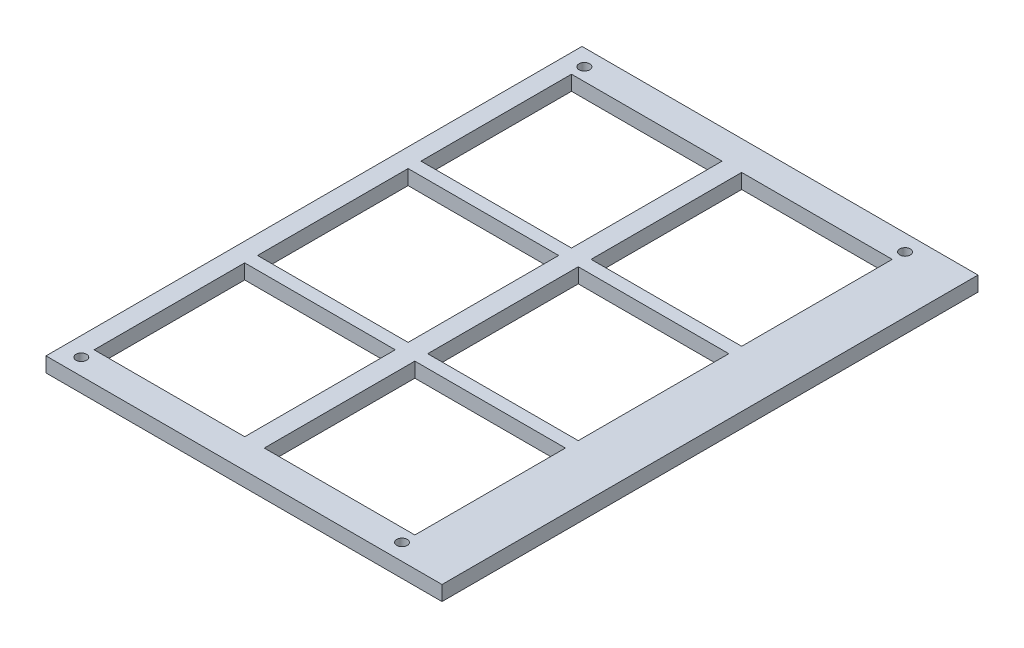
ISO-10303-21;
HEADER;
FILE_DESCRIPTION(('STEP AP214'),'2;1');
FILE_NAME('part.step','',(''),(''),'','','');
FILE_SCHEMA(('AUTOMOTIVE_DESIGN { 1 0 10303 214 1 1 1 1 }'));
ENDSEC;
DATA;
#1=APPLICATION_CONTEXT('core data for automotive mechanical design processes');
#2=APPLICATION_PROTOCOL_DEFINITION('international standard','automotive_design',2000,#1);
#3=PRODUCT_CONTEXT('',#1,'mechanical');
#4=PRODUCT('Part','Part','',(#3));
#5=PRODUCT_RELATED_PRODUCT_CATEGORY('part','',(#4));
#6=PRODUCT_DEFINITION_FORMATION('','',#4);
#7=PRODUCT_DEFINITION_CONTEXT('part definition',#1,'design');
#8=PRODUCT_DEFINITION('design','',#6,#7);
#9=PRODUCT_DEFINITION_SHAPE('','',#8);
#10=(LENGTH_UNIT() NAMED_UNIT(*) SI_UNIT(.MILLI.,.METRE.));
#11=(NAMED_UNIT(*) PLANE_ANGLE_UNIT() SI_UNIT($,.RADIAN.));
#12=(NAMED_UNIT(*) SI_UNIT($,.STERADIAN.) SOLID_ANGLE_UNIT());
#13=UNCERTAINTY_MEASURE_WITH_UNIT(LENGTH_MEASURE(1.E-05),#10,'distance_accuracy_value','');
#14=(GEOMETRIC_REPRESENTATION_CONTEXT(3) GLOBAL_UNCERTAINTY_ASSIGNED_CONTEXT((#13)) GLOBAL_UNIT_ASSIGNED_CONTEXT((#10,
#11,#12)) REPRESENTATION_CONTEXT('',''));
#15=CARTESIAN_POINT('',(0.,0.,0.));
#16=DIRECTION('',(0.,0.,1.));
#17=DIRECTION('',(1.,0.,0.));
#18=AXIS2_PLACEMENT_3D('',#15,#16,#17);
#19=CARTESIAN_POINT('',(0.,10.,0.));
#20=DIRECTION('',(0.,1.,0.));
#21=DIRECTION('',(0.,0.,1.));
#22=AXIS2_PLACEMENT_3D('',#19,#20,#21);
#23=PLANE('',#22);
#24=DIRECTION('',(0.,0.,1.));
#25=VECTOR('',#24,1.);
#26=CARTESIAN_POINT('',(-6.09,10.,59.465));
#27=LINE('',#26,#25);
#28=CARTESIAN_POINT('',(-6.09,10.,59.465));
#29=VERTEX_POINT('',#28);
#30=CARTESIAN_POINT('',(-6.09000000000003,10.,161.065));
#31=VERTEX_POINT('',#30);
#32=EDGE_CURVE('E48',#29,#31,#27,.T.);
#33=ORIENTED_EDGE('',*,*,#32,.F.);
#34=DIRECTION('',(-1.,0.,0.));
#35=VECTOR('',#34,1.);
#36=CARTESIAN_POINT('',(-6.09,10.,59.465));
#37=LINE('',#36,#35);
#38=CARTESIAN_POINT('',(95.51,10.,59.465));
#39=VERTEX_POINT('',#38);
#40=EDGE_CURVE('E236',#39,#29,#37,.T.);
#41=ORIENTED_EDGE('',*,*,#40,.F.);
#42=DIRECTION('',(0.,0.,-1.));
#43=VECTOR('',#42,1.);
#44=CARTESIAN_POINT('',(95.51,10.,59.465));
#45=LINE('',#44,#43);
#46=CARTESIAN_POINT('',(95.51,10.,161.065));
#47=VERTEX_POINT('',#46);
#48=EDGE_CURVE('E239',#47,#39,#45,.T.);
#49=ORIENTED_EDGE('',*,*,#48,.F.);
#50=DIRECTION('',(1.,0.,0.));
#51=VECTOR('',#50,1.);
#52=CARTESIAN_POINT('',(-6.09000000000003,10.,161.065));
#53=LINE('',#52,#51);
#54=EDGE_CURVE('E245',#31,#47,#53,.T.);
#55=ORIENTED_EDGE('',*,*,#54,.F.);
#56=EDGE_LOOP('',(#33,#41,#49,#55));
#57=FACE_BOUND('',#56,.T.);
#58=DIRECTION('',(0.,0.,1.));
#59=VECTOR('',#58,1.);
#60=CARTESIAN_POINT('',(-6.09000000000003,10.,-161.065));
#61=LINE('',#60,#59);
#62=CARTESIAN_POINT('',(-6.09000000000003,10.,-161.065));
#63=VERTEX_POINT('',#62);
#64=CARTESIAN_POINT('',(-6.09000000000005,10.,-59.465));
#65=VERTEX_POINT('',#64);
#66=EDGE_CURVE('E251',#63,#65,#61,.T.);
#67=ORIENTED_EDGE('',*,*,#66,.F.);
#68=DIRECTION('',(-1.,0.,0.));
#69=VECTOR('',#68,1.);
#70=CARTESIAN_POINT('',(-6.09000000000003,10.,-161.065));
#71=LINE('',#70,#69);
#72=CARTESIAN_POINT('',(95.51,10.,-161.065));
#73=VERTEX_POINT('',#72);
#74=EDGE_CURVE('E259',#73,#63,#71,.T.);
#75=ORIENTED_EDGE('',*,*,#74,.F.);
#76=DIRECTION('',(0.,0.,-1.));
#77=VECTOR('',#76,1.);
#78=CARTESIAN_POINT('',(95.51,10.,-161.065));
#79=LINE('',#78,#77);
#80=CARTESIAN_POINT('',(95.51,10.,-59.465));
#81=VERTEX_POINT('',#80);
#82=EDGE_CURVE('E273',#81,#73,#79,.T.);
#83=ORIENTED_EDGE('',*,*,#82,.F.);
#84=DIRECTION('',(1.,0.,0.));
#85=VECTOR('',#84,1.);
#86=CARTESIAN_POINT('',(-6.09000000000005,10.,-59.465));
#87=LINE('',#86,#85);
#88=EDGE_CURVE('E270',#65,#81,#87,.T.);
#89=ORIENTED_EDGE('',*,*,#88,.F.);
#90=EDGE_LOOP('',(#67,#75,#83,#89));
#91=FACE_BOUND('',#90,.T.);
#92=DIRECTION('',(0.,0.,1.));
#93=VECTOR('',#92,1.);
#94=CARTESIAN_POINT('',(-6.09000000000001,10.,-50.8));
#95=LINE('',#94,#93);
#96=CARTESIAN_POINT('',(-6.09000000000001,10.,-50.8));
#97=VERTEX_POINT('',#96);
#98=CARTESIAN_POINT('',(-6.09000000000004,10.,50.8));
#99=VERTEX_POINT('',#98);
#100=EDGE_CURVE('E280',#97,#99,#95,.T.);
#101=ORIENTED_EDGE('',*,*,#100,.F.);
#102=DIRECTION('',(-1.,0.,0.));
#103=VECTOR('',#102,1.);
#104=CARTESIAN_POINT('',(-6.09000000000001,10.,-50.8));
#105=LINE('',#104,#103);
#106=CARTESIAN_POINT('',(95.51,10.,-50.8));
#107=VERTEX_POINT('',#106);
#108=EDGE_CURVE('E291',#107,#97,#105,.T.);
#109=ORIENTED_EDGE('',*,*,#108,.F.);
#110=DIRECTION('',(0.,0.,-1.));
#111=VECTOR('',#110,1.);
#112=CARTESIAN_POINT('',(95.51,10.,-50.8));
#113=LINE('',#112,#111);
#114=CARTESIAN_POINT('',(95.51,10.,50.8));
#115=VERTEX_POINT('',#114);
#116=EDGE_CURVE('E305',#115,#107,#113,.T.);
#117=ORIENTED_EDGE('',*,*,#116,.F.);
#118=DIRECTION('',(1.,0.,0.));
#119=VECTOR('',#118,1.);
#120=CARTESIAN_POINT('',(-6.09000000000004,10.,50.8));
#121=LINE('',#120,#119);
#122=EDGE_CURVE('E302',#99,#115,#121,.T.);
#123=ORIENTED_EDGE('',*,*,#122,.F.);
#124=EDGE_LOOP('',(#101,#109,#117,#123));
#125=FACE_BOUND('',#124,.T.);
#126=DIRECTION('',(0.,0.,1.));
#127=VECTOR('',#126,1.);
#128=CARTESIAN_POINT('',(-120.91,10.,59.465));
#129=LINE('',#128,#127);
#130=CARTESIAN_POINT('',(-120.91,10.,59.465));
#131=VERTEX_POINT('',#130);
#132=CARTESIAN_POINT('',(-120.91,10.,161.065));
#133=VERTEX_POINT('',#132);
#134=EDGE_CURVE('E312',#131,#133,#129,.T.);
#135=ORIENTED_EDGE('',*,*,#134,.F.);
#136=DIRECTION('',(-1.,0.,0.));
#137=VECTOR('',#136,1.);
#138=CARTESIAN_POINT('',(-120.91,10.,59.465));
#139=LINE('',#138,#137);
#140=CARTESIAN_POINT('',(-19.31,10.,59.465));
#141=VERTEX_POINT('',#140);
#142=EDGE_CURVE('E323',#141,#131,#139,.T.);
#143=ORIENTED_EDGE('',*,*,#142,.F.);
#144=DIRECTION('',(0.,0.,-1.));
#145=VECTOR('',#144,1.);
#146=CARTESIAN_POINT('',(-19.31,10.,59.465));
#147=LINE('',#146,#145);
#148=CARTESIAN_POINT('',(-19.31,10.,161.065));
#149=VERTEX_POINT('',#148);
#150=EDGE_CURVE('E337',#149,#141,#147,.T.);
#151=ORIENTED_EDGE('',*,*,#150,.F.);
#152=DIRECTION('',(1.,0.,0.));
#153=VECTOR('',#152,1.);
#154=CARTESIAN_POINT('',(-120.91,10.,161.065));
#155=LINE('',#154,#153);
#156=EDGE_CURVE('E334',#133,#149,#155,.T.);
#157=ORIENTED_EDGE('',*,*,#156,.F.);
#158=EDGE_LOOP('',(#135,#143,#151,#157));
#159=FACE_BOUND('',#158,.T.);
#160=DIRECTION('',(0.,0.,1.));
#161=VECTOR('',#160,1.);
#162=CARTESIAN_POINT('',(-120.91,10.,-161.065));
#163=LINE('',#162,#161);
#164=CARTESIAN_POINT('',(-120.91,10.,-161.065));
#165=VERTEX_POINT('',#164);
#166=CARTESIAN_POINT('',(-120.91,10.,-59.465));
#167=VERTEX_POINT('',#166);
#168=EDGE_CURVE('E344',#165,#167,#163,.T.);
#169=ORIENTED_EDGE('',*,*,#168,.F.);
#170=DIRECTION('',(-1.,0.,0.));
#171=VECTOR('',#170,1.);
#172=CARTESIAN_POINT('',(-120.91,10.,-161.065));
#173=LINE('',#172,#171);
#174=CARTESIAN_POINT('',(-19.31,10.,-161.065));
#175=VERTEX_POINT('',#174);
#176=EDGE_CURVE('E355',#175,#165,#173,.T.);
#177=ORIENTED_EDGE('',*,*,#176,.F.);
#178=DIRECTION('',(0.,0.,-1.));
#179=VECTOR('',#178,1.);
#180=CARTESIAN_POINT('',(-19.31,10.,-161.065));
#181=LINE('',#180,#179);
#182=CARTESIAN_POINT('',(-19.31,10.,-59.465));
#183=VERTEX_POINT('',#182);
#184=EDGE_CURVE('E369',#183,#175,#181,.T.);
#185=ORIENTED_EDGE('',*,*,#184,.F.);
#186=DIRECTION('',(1.,0.,0.));
#187=VECTOR('',#186,1.);
#188=CARTESIAN_POINT('',(-120.91,10.,-59.465));
#189=LINE('',#188,#187);
#190=EDGE_CURVE('E366',#167,#183,#189,.T.);
#191=ORIENTED_EDGE('',*,*,#190,.F.);
#192=EDGE_LOOP('',(#169,#177,#185,#191));
#193=FACE_BOUND('',#192,.T.);
#194=DIRECTION('',(0.,0.,1.));
#195=VECTOR('',#194,1.);
#196=CARTESIAN_POINT('',(-120.91,10.,-50.8));
#197=LINE('',#196,#195);
#198=CARTESIAN_POINT('',(-120.91,10.,-50.8));
#199=VERTEX_POINT('',#198);
#200=CARTESIAN_POINT('',(-120.91,10.,50.8));
#201=VERTEX_POINT('',#200);
#202=EDGE_CURVE('E376',#199,#201,#197,.T.);
#203=ORIENTED_EDGE('',*,*,#202,.F.);
#204=DIRECTION('',(-1.,0.,0.));
#205=VECTOR('',#204,1.);
#206=CARTESIAN_POINT('',(-120.91,10.,-50.8));
#207=LINE('',#206,#205);
#208=CARTESIAN_POINT('',(-19.31,10.,-50.8));
#209=VERTEX_POINT('',#208);
#210=EDGE_CURVE('E387',#209,#199,#207,.T.);
#211=ORIENTED_EDGE('',*,*,#210,.F.);
#212=DIRECTION('',(0.,0.,-1.));
#213=VECTOR('',#212,1.);
#214=CARTESIAN_POINT('',(-19.31,10.,-50.8));
#215=LINE('',#214,#213);
#216=CARTESIAN_POINT('',(-19.31,10.,50.8));
#217=VERTEX_POINT('',#216);
#218=EDGE_CURVE('E401',#217,#209,#215,.T.);
#219=ORIENTED_EDGE('',*,*,#218,.F.);
#220=DIRECTION('',(1.,0.,0.));
#221=VECTOR('',#220,1.);
#222=CARTESIAN_POINT('',(-120.91,10.,50.8));
#223=LINE('',#222,#221);
#224=EDGE_CURVE('E398',#201,#217,#223,.T.);
#225=ORIENTED_EDGE('',*,*,#224,.F.);
#226=EDGE_LOOP('',(#203,#211,#219,#225));
#227=FACE_BOUND('',#226,.T.);
#228=CARTESIAN_POINT('',(95.51,10.,-169.7275));
#229=DIRECTION('',(0.,1.,0.));
#230=DIRECTION('',(0.,0.,1.));
#231=AXIS2_PLACEMENT_3D('',#228,#229,#230);
#232=CIRCLE('',#231,3.57);
#233=CARTESIAN_POINT('',(95.51,10.,-166.1575));
#234=VERTEX_POINT('',#233);
#235=EDGE_CURVE('E421',#234,#234,#232,.T.);
#236=ORIENTED_EDGE('',*,*,#235,.F.);
#237=EDGE_LOOP('',(#236));
#238=FACE_BOUND('',#237,.T.);
#239=CARTESIAN_POINT('',(-120.91,10.,169.7275));
#240=DIRECTION('',(0.,1.,0.));
#241=DIRECTION('',(0.,0.,1.));
#242=AXIS2_PLACEMENT_3D('',#239,#240,#241);
#243=CIRCLE('',#242,3.57);
#244=CARTESIAN_POINT('',(-120.91,10.,173.2975));
#245=VERTEX_POINT('',#244);
#246=EDGE_CURVE('E433',#245,#245,#243,.T.);
#247=ORIENTED_EDGE('',*,*,#246,.F.);
#248=EDGE_LOOP('',(#247));
#249=FACE_BOUND('',#248,.T.);
#250=DIRECTION('',(0.,0.,1.));
#251=VECTOR('',#250,1.);
#252=CARTESIAN_POINT('',(-133.61,10.,-180.84));
#253=LINE('',#252,#251);
#254=CARTESIAN_POINT('',(-133.61,10.,-180.84));
#255=VERTEX_POINT('',#254);
#256=CARTESIAN_POINT('',(-133.61,10.,180.84));
#257=VERTEX_POINT('',#256);
#258=EDGE_CURVE('E439',#255,#257,#253,.T.);
#259=ORIENTED_EDGE('',*,*,#258,.T.);
#260=DIRECTION('',(1.,0.,0.));
#261=VECTOR('',#260,1.);
#262=CARTESIAN_POINT('',(-133.61,10.,180.84));
#263=LINE('',#262,#261);
#264=CARTESIAN_POINT('',(133.61,10.,180.84));
#265=VERTEX_POINT('',#264);
#266=EDGE_CURVE('E442',#257,#265,#263,.T.);
#267=ORIENTED_EDGE('',*,*,#266,.T.);
#268=DIRECTION('',(0.,0.,-1.));
#269=VECTOR('',#268,1.);
#270=CARTESIAN_POINT('',(133.61,10.,-180.84));
#271=LINE('',#270,#269);
#272=CARTESIAN_POINT('',(133.61,10.,-180.84));
#273=VERTEX_POINT('',#272);
#274=EDGE_CURVE('E445',#265,#273,#271,.T.);
#275=ORIENTED_EDGE('',*,*,#274,.T.);
#276=DIRECTION('',(-1.,0.,0.));
#277=VECTOR('',#276,1.);
#278=CARTESIAN_POINT('',(-133.61,10.,-180.84));
#279=LINE('',#278,#277);
#280=EDGE_CURVE('E447',#273,#255,#279,.T.);
#281=ORIENTED_EDGE('',*,*,#280,.T.);
#282=EDGE_LOOP('',(#259,#267,#275,#281));
#283=FACE_BOUND('',#282,.T.);
#284=CARTESIAN_POINT('',(-120.91,10.,-169.7275));
#285=DIRECTION('',(0.,1.,0.));
#286=DIRECTION('',(0.,0.,1.));
#287=AXIS2_PLACEMENT_3D('',#284,#285,#286);
#288=CIRCLE('',#287,3.57);
#289=CARTESIAN_POINT('',(-120.91,10.,-166.1575));
#290=VERTEX_POINT('',#289);
#291=EDGE_CURVE('E427',#290,#290,#288,.T.);
#292=ORIENTED_EDGE('',*,*,#291,.F.);
#293=EDGE_LOOP('',(#292));
#294=FACE_BOUND('',#293,.T.);
#295=CARTESIAN_POINT('',(95.51,10.,169.7275));
#296=DIRECTION('',(0.,1.,0.));
#297=DIRECTION('',(0.,0.,1.));
#298=AXIS2_PLACEMENT_3D('',#295,#296,#297);
#299=CIRCLE('',#298,3.57);
#300=CARTESIAN_POINT('',(95.51,10.,173.2975));
#301=VERTEX_POINT('',#300);
#302=EDGE_CURVE('E415',#301,#301,#299,.T.);
#303=ORIENTED_EDGE('',*,*,#302,.F.);
#304=EDGE_LOOP('',(#303));
#305=FACE_BOUND('',#304,.T.);
#306=ADVANCED_FACE('F33',(#57,#91,#125,#159,#193,#227,#238,#249,#283,#294,#305),#23,.T.);
#307=CARTESIAN_POINT('',(0.,0.,0.));
#308=DIRECTION('',(0.,1.,0.));
#309=DIRECTION('',(0.,0.,1.));
#310=AXIS2_PLACEMENT_3D('',#307,#308,#309);
#311=PLANE('',#310);
#312=DIRECTION('',(-1.,0.,0.));
#313=VECTOR('',#312,1.);
#314=CARTESIAN_POINT('',(-6.09,0.,59.465));
#315=LINE('',#314,#313);
#316=CARTESIAN_POINT('',(95.51,0.,59.465));
#317=VERTEX_POINT('',#316);
#318=CARTESIAN_POINT('',(-6.09,0.,59.465));
#319=VERTEX_POINT('',#318);
#320=EDGE_CURVE('E226',#317,#319,#315,.T.);
#321=ORIENTED_EDGE('',*,*,#320,.T.);
#322=DIRECTION('',(0.,0.,1.));
#323=VECTOR('',#322,1.);
#324=CARTESIAN_POINT('',(-6.09,0.,59.465));
#325=LINE('',#324,#323);
#326=CARTESIAN_POINT('',(-6.09000000000003,0.,161.065));
#327=VERTEX_POINT('',#326);
#328=EDGE_CURVE('E220',#319,#327,#325,.T.);
#329=ORIENTED_EDGE('',*,*,#328,.T.);
#330=DIRECTION('',(1.,0.,0.));
#331=VECTOR('',#330,1.);
#332=CARTESIAN_POINT('',(-6.09000000000003,0.,161.065));
#333=LINE('',#332,#331);
#334=CARTESIAN_POINT('',(95.51,0.,161.065));
#335=VERTEX_POINT('',#334);
#336=EDGE_CURVE('E229',#327,#335,#333,.T.);
#337=ORIENTED_EDGE('',*,*,#336,.T.);
#338=DIRECTION('',(0.,0.,-1.));
#339=VECTOR('',#338,1.);
#340=CARTESIAN_POINT('',(95.51,0.,59.465));
#341=LINE('',#340,#339);
#342=EDGE_CURVE('E56',#335,#317,#341,.T.);
#343=ORIENTED_EDGE('',*,*,#342,.T.);
#344=EDGE_LOOP('',(#321,#329,#337,#343));
#345=FACE_BOUND('',#344,.T.);
#346=DIRECTION('',(-1.,0.,0.));
#347=VECTOR('',#346,1.);
#348=CARTESIAN_POINT('',(-6.09000000000003,0.,-161.065));
#349=LINE('',#348,#347);
#350=CARTESIAN_POINT('',(95.51,0.,-161.065));
#351=VERTEX_POINT('',#350);
#352=CARTESIAN_POINT('',(-6.09000000000003,0.,-161.065));
#353=VERTEX_POINT('',#352);
#354=EDGE_CURVE('E265',#351,#353,#349,.T.);
#355=ORIENTED_EDGE('',*,*,#354,.T.);
#356=DIRECTION('',(0.,0.,1.));
#357=VECTOR('',#356,1.);
#358=CARTESIAN_POINT('',(-6.09000000000003,0.,-161.065));
#359=LINE('',#358,#357);
#360=CARTESIAN_POINT('',(-6.09000000000005,0.,-59.465));
#361=VERTEX_POINT('',#360);
#362=EDGE_CURVE('E255',#353,#361,#359,.T.);
#363=ORIENTED_EDGE('',*,*,#362,.T.);
#364=DIRECTION('',(1.,0.,0.));
#365=VECTOR('',#364,1.);
#366=CARTESIAN_POINT('',(-6.09000000000005,0.,-59.465));
#367=LINE('',#366,#365);
#368=CARTESIAN_POINT('',(95.51,0.,-59.465));
#369=VERTEX_POINT('',#368);
#370=EDGE_CURVE('E258',#361,#369,#367,.T.);
#371=ORIENTED_EDGE('',*,*,#370,.T.);
#372=DIRECTION('',(0.,0.,-1.));
#373=VECTOR('',#372,1.);
#374=CARTESIAN_POINT('',(95.51,0.,-161.065));
#375=LINE('',#374,#373);
#376=EDGE_CURVE('E262',#369,#351,#375,.T.);
#377=ORIENTED_EDGE('',*,*,#376,.T.);
#378=EDGE_LOOP('',(#355,#363,#371,#377));
#379=FACE_BOUND('',#378,.T.);
#380=DIRECTION('',(-1.,0.,0.));
#381=VECTOR('',#380,1.);
#382=CARTESIAN_POINT('',(-6.09000000000001,0.,-50.8));
#383=LINE('',#382,#381);
#384=CARTESIAN_POINT('',(95.51,0.,-50.8));
#385=VERTEX_POINT('',#384);
#386=CARTESIAN_POINT('',(-6.09000000000001,0.,-50.8));
#387=VERTEX_POINT('',#386);
#388=EDGE_CURVE('E297',#385,#387,#383,.T.);
#389=ORIENTED_EDGE('',*,*,#388,.T.);
#390=DIRECTION('',(0.,0.,1.));
#391=VECTOR('',#390,1.);
#392=CARTESIAN_POINT('',(-6.09000000000001,0.,-50.8));
#393=LINE('',#392,#391);
#394=CARTESIAN_POINT('',(-6.09000000000004,0.,50.8));
#395=VERTEX_POINT('',#394);
#396=EDGE_CURVE('E287',#387,#395,#393,.T.);
#397=ORIENTED_EDGE('',*,*,#396,.T.);
#398=DIRECTION('',(1.,0.,0.));
#399=VECTOR('',#398,1.);
#400=CARTESIAN_POINT('',(-6.09000000000004,0.,50.8));
#401=LINE('',#400,#399);
#402=CARTESIAN_POINT('',(95.51,0.,50.8));
#403=VERTEX_POINT('',#402);
#404=EDGE_CURVE('E290',#395,#403,#401,.T.);
#405=ORIENTED_EDGE('',*,*,#404,.T.);
#406=DIRECTION('',(0.,0.,-1.));
#407=VECTOR('',#406,1.);
#408=CARTESIAN_POINT('',(95.51,0.,-50.8));
#409=LINE('',#408,#407);
#410=EDGE_CURVE('E294',#403,#385,#409,.T.);
#411=ORIENTED_EDGE('',*,*,#410,.T.);
#412=EDGE_LOOP('',(#389,#397,#405,#411));
#413=FACE_BOUND('',#412,.T.);
#414=DIRECTION('',(-1.,0.,0.));
#415=VECTOR('',#414,1.);
#416=CARTESIAN_POINT('',(-120.91,0.,59.465));
#417=LINE('',#416,#415);
#418=CARTESIAN_POINT('',(-19.31,0.,59.465));
#419=VERTEX_POINT('',#418);
#420=CARTESIAN_POINT('',(-120.91,0.,59.465));
#421=VERTEX_POINT('',#420);
#422=EDGE_CURVE('E329',#419,#421,#417,.T.);
#423=ORIENTED_EDGE('',*,*,#422,.T.);
#424=DIRECTION('',(0.,0.,1.));
#425=VECTOR('',#424,1.);
#426=CARTESIAN_POINT('',(-120.91,0.,59.465));
#427=LINE('',#426,#425);
#428=CARTESIAN_POINT('',(-120.91,0.,161.065));
#429=VERTEX_POINT('',#428);
#430=EDGE_CURVE('E319',#421,#429,#427,.T.);
#431=ORIENTED_EDGE('',*,*,#430,.T.);
#432=DIRECTION('',(1.,0.,0.));
#433=VECTOR('',#432,1.);
#434=CARTESIAN_POINT('',(-120.91,0.,161.065));
#435=LINE('',#434,#433);
#436=CARTESIAN_POINT('',(-19.31,0.,161.065));
#437=VERTEX_POINT('',#436);
#438=EDGE_CURVE('E322',#429,#437,#435,.T.);
#439=ORIENTED_EDGE('',*,*,#438,.T.);
#440=DIRECTION('',(0.,0.,-1.));
#441=VECTOR('',#440,1.);
#442=CARTESIAN_POINT('',(-19.31,0.,59.465));
#443=LINE('',#442,#441);
#444=EDGE_CURVE('E326',#437,#419,#443,.T.);
#445=ORIENTED_EDGE('',*,*,#444,.T.);
#446=EDGE_LOOP('',(#423,#431,#439,#445));
#447=FACE_BOUND('',#446,.T.);
#448=DIRECTION('',(-1.,0.,0.));
#449=VECTOR('',#448,1.);
#450=CARTESIAN_POINT('',(-120.91,0.,-161.065));
#451=LINE('',#450,#449);
#452=CARTESIAN_POINT('',(-19.31,0.,-161.065));
#453=VERTEX_POINT('',#452);
#454=CARTESIAN_POINT('',(-120.91,0.,-161.065));
#455=VERTEX_POINT('',#454);
#456=EDGE_CURVE('E361',#453,#455,#451,.T.);
#457=ORIENTED_EDGE('',*,*,#456,.T.);
#458=DIRECTION('',(0.,0.,1.));
#459=VECTOR('',#458,1.);
#460=CARTESIAN_POINT('',(-120.91,0.,-161.065));
#461=LINE('',#460,#459);
#462=CARTESIAN_POINT('',(-120.91,0.,-59.465));
#463=VERTEX_POINT('',#462);
#464=EDGE_CURVE('E351',#455,#463,#461,.T.);
#465=ORIENTED_EDGE('',*,*,#464,.T.);
#466=DIRECTION('',(1.,0.,0.));
#467=VECTOR('',#466,1.);
#468=CARTESIAN_POINT('',(-120.91,0.,-59.465));
#469=LINE('',#468,#467);
#470=CARTESIAN_POINT('',(-19.31,0.,-59.465));
#471=VERTEX_POINT('',#470);
#472=EDGE_CURVE('E354',#463,#471,#469,.T.);
#473=ORIENTED_EDGE('',*,*,#472,.T.);
#474=DIRECTION('',(0.,0.,-1.));
#475=VECTOR('',#474,1.);
#476=CARTESIAN_POINT('',(-19.31,0.,-161.065));
#477=LINE('',#476,#475);
#478=EDGE_CURVE('E358',#471,#453,#477,.T.);
#479=ORIENTED_EDGE('',*,*,#478,.T.);
#480=EDGE_LOOP('',(#457,#465,#473,#479));
#481=FACE_BOUND('',#480,.T.);
#482=DIRECTION('',(-1.,0.,0.));
#483=VECTOR('',#482,1.);
#484=CARTESIAN_POINT('',(-120.91,0.,-50.8));
#485=LINE('',#484,#483);
#486=CARTESIAN_POINT('',(-19.31,0.,-50.8));
#487=VERTEX_POINT('',#486);
#488=CARTESIAN_POINT('',(-120.91,0.,-50.8));
#489=VERTEX_POINT('',#488);
#490=EDGE_CURVE('E393',#487,#489,#485,.T.);
#491=ORIENTED_EDGE('',*,*,#490,.T.);
#492=DIRECTION('',(0.,0.,1.));
#493=VECTOR('',#492,1.);
#494=CARTESIAN_POINT('',(-120.91,0.,-50.8));
#495=LINE('',#494,#493);
#496=CARTESIAN_POINT('',(-120.91,0.,50.8));
#497=VERTEX_POINT('',#496);
#498=EDGE_CURVE('E383',#489,#497,#495,.T.);
#499=ORIENTED_EDGE('',*,*,#498,.T.);
#500=DIRECTION('',(1.,0.,0.));
#501=VECTOR('',#500,1.);
#502=CARTESIAN_POINT('',(-120.91,0.,50.8));
#503=LINE('',#502,#501);
#504=CARTESIAN_POINT('',(-19.31,0.,50.8));
#505=VERTEX_POINT('',#504);
#506=EDGE_CURVE('E386',#497,#505,#503,.T.);
#507=ORIENTED_EDGE('',*,*,#506,.T.);
#508=DIRECTION('',(0.,0.,-1.));
#509=VECTOR('',#508,1.);
#510=CARTESIAN_POINT('',(-19.31,0.,-50.8));
#511=LINE('',#510,#509);
#512=EDGE_CURVE('E390',#505,#487,#511,.T.);
#513=ORIENTED_EDGE('',*,*,#512,.T.);
#514=EDGE_LOOP('',(#491,#499,#507,#513));
#515=FACE_BOUND('',#514,.T.);
#516=CARTESIAN_POINT('',(95.51,0.,-169.7275));
#517=DIRECTION('',(0.,1.,0.));
#518=DIRECTION('',(0.,0.,1.));
#519=AXIS2_PLACEMENT_3D('',#516,#517,#518);
#520=CIRCLE('',#519,3.57);
#521=CARTESIAN_POINT('',(95.51,0.,-166.1575));
#522=VERTEX_POINT('',#521);
#523=EDGE_CURVE('E418',#522,#522,#520,.T.);
#524=ORIENTED_EDGE('',*,*,#523,.T.);
#525=EDGE_LOOP('',(#524));
#526=FACE_BOUND('',#525,.T.);
#527=CARTESIAN_POINT('',(-120.91,0.,169.7275));
#528=DIRECTION('',(0.,1.,0.));
#529=DIRECTION('',(0.,0.,1.));
#530=AXIS2_PLACEMENT_3D('',#527,#528,#529);
#531=CIRCLE('',#530,3.57);
#532=CARTESIAN_POINT('',(-120.91,0.,173.2975));
#533=VERTEX_POINT('',#532);
#534=EDGE_CURVE('E430',#533,#533,#531,.T.);
#535=ORIENTED_EDGE('',*,*,#534,.T.);
#536=EDGE_LOOP('',(#535));
#537=FACE_BOUND('',#536,.T.);
#538=DIRECTION('',(0.,0.,1.));
#539=VECTOR('',#538,1.);
#540=CARTESIAN_POINT('',(-133.61,0.,-180.84));
#541=LINE('',#540,#539);
#542=CARTESIAN_POINT('',(-133.61,0.,-180.84));
#543=VERTEX_POINT('',#542);
#544=CARTESIAN_POINT('',(-133.61,0.,180.84));
#545=VERTEX_POINT('',#544);
#546=EDGE_CURVE('E436',#543,#545,#541,.T.);
#547=ORIENTED_EDGE('',*,*,#546,.F.);
#548=DIRECTION('',(-1.,0.,0.));
#549=VECTOR('',#548,1.);
#550=CARTESIAN_POINT('',(-133.61,0.,-180.84));
#551=LINE('',#550,#549);
#552=CARTESIAN_POINT('',(133.61,0.,-180.84));
#553=VERTEX_POINT('',#552);
#554=EDGE_CURVE('E443',#553,#543,#551,.T.);
#555=ORIENTED_EDGE('',*,*,#554,.F.);
#556=DIRECTION('',(0.,0.,-1.));
#557=VECTOR('',#556,1.);
#558=CARTESIAN_POINT('',(133.61,0.,-180.84));
#559=LINE('',#558,#557);
#560=CARTESIAN_POINT('',(133.61,0.,180.84));
#561=VERTEX_POINT('',#560);
#562=EDGE_CURVE('E454',#561,#553,#559,.T.);
#563=ORIENTED_EDGE('',*,*,#562,.F.);
#564=DIRECTION('',(1.,0.,0.));
#565=VECTOR('',#564,1.);
#566=CARTESIAN_POINT('',(-133.61,0.,180.84));
#567=LINE('',#566,#565);
#568=EDGE_CURVE('E452',#545,#561,#567,.T.);
#569=ORIENTED_EDGE('',*,*,#568,.F.);
#570=EDGE_LOOP('',(#547,#555,#563,#569));
#571=FACE_BOUND('',#570,.T.);
#572=CARTESIAN_POINT('',(-120.91,0.,-169.7275));
#573=DIRECTION('',(0.,1.,0.));
#574=DIRECTION('',(0.,0.,1.));
#575=AXIS2_PLACEMENT_3D('',#572,#573,#574);
#576=CIRCLE('',#575,3.57);
#577=CARTESIAN_POINT('',(-120.91,0.,-166.1575));
#578=VERTEX_POINT('',#577);
#579=EDGE_CURVE('E424',#578,#578,#576,.T.);
#580=ORIENTED_EDGE('',*,*,#579,.T.);
#581=EDGE_LOOP('',(#580));
#582=FACE_BOUND('',#581,.T.);
#583=CARTESIAN_POINT('',(95.51,0.,169.7275));
#584=DIRECTION('',(0.,1.,0.));
#585=DIRECTION('',(0.,0.,1.));
#586=AXIS2_PLACEMENT_3D('',#583,#584,#585);
#587=CIRCLE('',#586,3.57);
#588=CARTESIAN_POINT('',(95.51,0.,173.2975));
#589=VERTEX_POINT('',#588);
#590=EDGE_CURVE('E408',#589,#589,#587,.T.);
#591=ORIENTED_EDGE('',*,*,#590,.T.);
#592=EDGE_LOOP('',(#591));
#593=FACE_BOUND('',#592,.T.);
#594=ADVANCED_FACE('F233',(#345,#379,#413,#447,#481,#515,#526,#537,#571,#582,#593),#311,.F.);
#595=CARTESIAN_POINT('',(-133.61,10.,-180.84));
#596=DIRECTION('',(1.,0.,0.));
#597=DIRECTION('',(0.,0.,-1.));
#598=AXIS2_PLACEMENT_3D('',#595,#596,#597);
#599=PLANE('',#598);
#600=ORIENTED_EDGE('',*,*,#546,.T.);
#601=DIRECTION('',(0.,-1.,0.));
#602=VECTOR('',#601,1.);
#603=CARTESIAN_POINT('',(-133.61,10.,180.84));
#604=LINE('',#603,#602);
#605=EDGE_CURVE('E11',#257,#545,#604,.T.);
#606=ORIENTED_EDGE('',*,*,#605,.F.);
#607=ORIENTED_EDGE('',*,*,#258,.F.);
#608=DIRECTION('',(0.,-1.,0.));
#609=VECTOR('',#608,1.);
#610=CARTESIAN_POINT('',(-133.61,10.,-180.84));
#611=LINE('',#610,#609);
#612=EDGE_CURVE('E449',#255,#543,#611,.T.);
#613=ORIENTED_EDGE('',*,*,#612,.T.);
#614=EDGE_LOOP('',(#600,#606,#607,#613));
#615=FACE_BOUND('',#614,.T.);
#616=ADVANCED_FACE('F35',(#615),#599,.F.);
#617=CARTESIAN_POINT('',(-133.61,10.,180.84));
#618=DIRECTION('',(0.,0.,-1.));
#619=DIRECTION('',(-1.,0.,0.));
#620=AXIS2_PLACEMENT_3D('',#617,#618,#619);
#621=PLANE('',#620);
#622=ORIENTED_EDGE('',*,*,#568,.T.);
#623=DIRECTION('',(0.,-1.,0.));
#624=VECTOR('',#623,1.);
#625=CARTESIAN_POINT('',(133.61,10.,180.84));
#626=LINE('',#625,#624);
#627=EDGE_CURVE('E41',#265,#561,#626,.T.);
#628=ORIENTED_EDGE('',*,*,#627,.F.);
#629=ORIENTED_EDGE('',*,*,#266,.F.);
#630=ORIENTED_EDGE('',*,*,#605,.T.);
#631=EDGE_LOOP('',(#622,#628,#629,#630));
#632=FACE_BOUND('',#631,.T.);
#633=ADVANCED_FACE('F482',(#632),#621,.F.);
#634=CARTESIAN_POINT('',(133.61,10.,-180.84));
#635=DIRECTION('',(-1.,0.,0.));
#636=DIRECTION('',(0.,0.,1.));
#637=AXIS2_PLACEMENT_3D('',#634,#635,#636);
#638=PLANE('',#637);
#639=ORIENTED_EDGE('',*,*,#562,.T.);
#640=DIRECTION('',(0.,-1.,0.));
#641=VECTOR('',#640,1.);
#642=CARTESIAN_POINT('',(133.61,10.,-180.84));
#643=LINE('',#642,#641);
#644=EDGE_CURVE('E459',#273,#553,#643,.T.);
#645=ORIENTED_EDGE('',*,*,#644,.F.);
#646=ORIENTED_EDGE('',*,*,#274,.F.);
#647=ORIENTED_EDGE('',*,*,#627,.T.);
#648=EDGE_LOOP('',(#639,#645,#646,#647));
#649=FACE_BOUND('',#648,.T.);
#650=ADVANCED_FACE('F466',(#649),#638,.F.);
#651=CARTESIAN_POINT('',(-133.61,10.,-180.84));
#652=DIRECTION('',(0.,0.,1.));
#653=DIRECTION('',(1.,0.,0.));
#654=AXIS2_PLACEMENT_3D('',#651,#652,#653);
#655=PLANE('',#654);
#656=ORIENTED_EDGE('',*,*,#554,.T.);
#657=ORIENTED_EDGE('',*,*,#612,.F.);
#658=ORIENTED_EDGE('',*,*,#280,.F.);
#659=ORIENTED_EDGE('',*,*,#644,.T.);
#660=EDGE_LOOP('',(#656,#657,#658,#659));
#661=FACE_BOUND('',#660,.T.);
#662=ADVANCED_FACE('F475',(#661),#655,.F.);
#663=CARTESIAN_POINT('',(-120.91,10.,169.7275));
#664=DIRECTION('',(0.,-1.,0.));
#665=DIRECTION('',(0.,0.,-1.));
#666=AXIS2_PLACEMENT_3D('',#663,#664,#665);
#667=CYLINDRICAL_SURFACE('',#666,3.57);
#668=ORIENTED_EDGE('',*,*,#246,.T.);
#669=EDGE_LOOP('',(#668));
#670=FACE_BOUND('',#669,.T.);
#671=ORIENTED_EDGE('',*,*,#534,.F.);
#672=EDGE_LOOP('',(#671));
#673=FACE_BOUND('',#672,.T.);
#674=ADVANCED_FACE('F498',(#670,#673),#667,.F.);
#675=CARTESIAN_POINT('',(-120.91,10.,-169.7275));
#676=DIRECTION('',(0.,-1.,0.));
#677=DIRECTION('',(0.,0.,-1.));
#678=AXIS2_PLACEMENT_3D('',#675,#676,#677);
#679=CYLINDRICAL_SURFACE('',#678,3.57);
#680=ORIENTED_EDGE('',*,*,#291,.T.);
#681=EDGE_LOOP('',(#680));
#682=FACE_BOUND('',#681,.T.);
#683=ORIENTED_EDGE('',*,*,#579,.F.);
#684=EDGE_LOOP('',(#683));
#685=FACE_BOUND('',#684,.T.);
#686=ADVANCED_FACE('F505',(#682,#685),#679,.F.);
#687=CARTESIAN_POINT('',(95.51,10.,-169.7275));
#688=DIRECTION('',(0.,-1.,0.));
#689=DIRECTION('',(0.,0.,-1.));
#690=AXIS2_PLACEMENT_3D('',#687,#688,#689);
#691=CYLINDRICAL_SURFACE('',#690,3.57);
#692=ORIENTED_EDGE('',*,*,#235,.T.);
#693=EDGE_LOOP('',(#692));
#694=FACE_BOUND('',#693,.T.);
#695=ORIENTED_EDGE('',*,*,#523,.F.);
#696=EDGE_LOOP('',(#695));
#697=FACE_BOUND('',#696,.T.);
#698=ADVANCED_FACE('F510',(#694,#697),#691,.F.);
#699=CARTESIAN_POINT('',(95.51,10.,169.7275));
#700=DIRECTION('',(0.,-1.,0.));
#701=DIRECTION('',(0.,0.,-1.));
#702=AXIS2_PLACEMENT_3D('',#699,#700,#701);
#703=CYLINDRICAL_SURFACE('',#702,3.57);
#704=ORIENTED_EDGE('',*,*,#302,.T.);
#705=EDGE_LOOP('',(#704));
#706=FACE_BOUND('',#705,.T.);
#707=ORIENTED_EDGE('',*,*,#590,.F.);
#708=EDGE_LOOP('',(#707));
#709=FACE_BOUND('',#708,.T.);
#710=ADVANCED_FACE('F520',(#706,#709),#703,.F.);
#711=CARTESIAN_POINT('',(-120.91,0.,-50.8));
#712=DIRECTION('',(-1.,0.,0.));
#713=DIRECTION('',(0.,0.,1.));
#714=AXIS2_PLACEMENT_3D('',#711,#712,#713);
#715=PLANE('',#714);
#716=ORIENTED_EDGE('',*,*,#202,.T.);
#717=DIRECTION('',(0.,1.,0.));
#718=VECTOR('',#717,1.);
#719=CARTESIAN_POINT('',(-120.91,0.,50.8));
#720=LINE('',#719,#718);
#721=EDGE_CURVE('E396',#497,#201,#720,.T.);
#722=ORIENTED_EDGE('',*,*,#721,.F.);
#723=ORIENTED_EDGE('',*,*,#498,.F.);
#724=DIRECTION('',(0.,1.,0.));
#725=VECTOR('',#724,1.);
#726=CARTESIAN_POINT('',(-120.91,0.,-50.8));
#727=LINE('',#726,#725);
#728=EDGE_CURVE('E406',#489,#199,#727,.T.);
#729=ORIENTED_EDGE('',*,*,#728,.T.);
#730=EDGE_LOOP('',(#716,#722,#723,#729));
#731=FACE_BOUND('',#730,.T.);
#732=ADVANCED_FACE('F527',(#731),#715,.F.);
#733=CARTESIAN_POINT('',(-120.91,0.,-50.8));
#734=DIRECTION('',(0.,0.,-1.));
#735=DIRECTION('',(-1.,0.,0.));
#736=AXIS2_PLACEMENT_3D('',#733,#734,#735);
#737=PLANE('',#736);
#738=ORIENTED_EDGE('',*,*,#210,.T.);
#739=ORIENTED_EDGE('',*,*,#728,.F.);
#740=ORIENTED_EDGE('',*,*,#490,.F.);
#741=DIRECTION('',(0.,1.,0.));
#742=VECTOR('',#741,1.);
#743=CARTESIAN_POINT('',(-19.31,0.,-50.8));
#744=LINE('',#743,#742);
#745=EDGE_CURVE('E409',#487,#209,#744,.T.);
#746=ORIENTED_EDGE('',*,*,#745,.T.);
#747=EDGE_LOOP('',(#738,#739,#740,#746));
#748=FACE_BOUND('',#747,.T.);
#749=ADVANCED_FACE('F531',(#748),#737,.F.);
#750=CARTESIAN_POINT('',(-19.31,0.,-50.8));
#751=DIRECTION('',(1.,0.,0.));
#752=DIRECTION('',(0.,0.,-1.));
#753=AXIS2_PLACEMENT_3D('',#750,#751,#752);
#754=PLANE('',#753);
#755=ORIENTED_EDGE('',*,*,#218,.T.);
#756=ORIENTED_EDGE('',*,*,#745,.F.);
#757=ORIENTED_EDGE('',*,*,#512,.F.);
#758=DIRECTION('',(0.,1.,0.));
#759=VECTOR('',#758,1.);
#760=CARTESIAN_POINT('',(-19.31,0.,50.8));
#761=LINE('',#760,#759);
#762=EDGE_CURVE('E411',#505,#217,#761,.T.);
#763=ORIENTED_EDGE('',*,*,#762,.T.);
#764=EDGE_LOOP('',(#755,#756,#757,#763));
#765=FACE_BOUND('',#764,.T.);
#766=ADVANCED_FACE('F537',(#765),#754,.F.);
#767=CARTESIAN_POINT('',(-120.91,0.,50.8));
#768=DIRECTION('',(0.,0.,1.));
#769=DIRECTION('',(1.,0.,0.));
#770=AXIS2_PLACEMENT_3D('',#767,#768,#769);
#771=PLANE('',#770);
#772=ORIENTED_EDGE('',*,*,#224,.T.);
#773=ORIENTED_EDGE('',*,*,#762,.F.);
#774=ORIENTED_EDGE('',*,*,#506,.F.);
#775=ORIENTED_EDGE('',*,*,#721,.T.);
#776=EDGE_LOOP('',(#772,#773,#774,#775));
#777=FACE_BOUND('',#776,.T.);
#778=ADVANCED_FACE('F533',(#777),#771,.F.);
#779=CARTESIAN_POINT('',(-120.91,0.,-161.065));
#780=DIRECTION('',(-1.,0.,0.));
#781=DIRECTION('',(0.,0.,1.));
#782=AXIS2_PLACEMENT_3D('',#779,#780,#781);
#783=PLANE('',#782);
#784=ORIENTED_EDGE('',*,*,#168,.T.);
#785=DIRECTION('',(0.,1.,0.));
#786=VECTOR('',#785,1.);
#787=CARTESIAN_POINT('',(-120.91,0.,-59.465));
#788=LINE('',#787,#786);
#789=EDGE_CURVE('E364',#463,#167,#788,.T.);
#790=ORIENTED_EDGE('',*,*,#789,.F.);
#791=ORIENTED_EDGE('',*,*,#464,.F.);
#792=DIRECTION('',(0.,1.,0.));
#793=VECTOR('',#792,1.);
#794=CARTESIAN_POINT('',(-120.91,0.,-161.065));
#795=LINE('',#794,#793);
#796=EDGE_CURVE('E374',#455,#165,#795,.T.);
#797=ORIENTED_EDGE('',*,*,#796,.T.);
#798=EDGE_LOOP('',(#784,#790,#791,#797));
#799=FACE_BOUND('',#798,.T.);
#800=ADVANCED_FACE('F536',(#799),#783,.F.);
#801=CARTESIAN_POINT('',(-120.91,0.,-161.065));
#802=DIRECTION('',(0.,0.,-1.));
#803=DIRECTION('',(-1.,0.,0.));
#804=AXIS2_PLACEMENT_3D('',#801,#802,#803);
#805=PLANE('',#804);
#806=ORIENTED_EDGE('',*,*,#176,.T.);
#807=ORIENTED_EDGE('',*,*,#796,.F.);
#808=ORIENTED_EDGE('',*,*,#456,.F.);
#809=DIRECTION('',(0.,1.,0.));
#810=VECTOR('',#809,1.);
#811=CARTESIAN_POINT('',(-19.31,0.,-161.065));
#812=LINE('',#811,#810);
#813=EDGE_CURVE('E377',#453,#175,#812,.T.);
#814=ORIENTED_EDGE('',*,*,#813,.T.);
#815=EDGE_LOOP('',(#806,#807,#808,#814));
#816=FACE_BOUND('',#815,.T.);
#817=ADVANCED_FACE('F547',(#816),#805,.F.);
#818=CARTESIAN_POINT('',(-19.31,0.,-161.065));
#819=DIRECTION('',(1.,0.,0.));
#820=DIRECTION('',(0.,0.,-1.));
#821=AXIS2_PLACEMENT_3D('',#818,#819,#820);
#822=PLANE('',#821);
#823=ORIENTED_EDGE('',*,*,#184,.T.);
#824=ORIENTED_EDGE('',*,*,#813,.F.);
#825=ORIENTED_EDGE('',*,*,#478,.F.);
#826=DIRECTION('',(0.,1.,0.));
#827=VECTOR('',#826,1.);
#828=CARTESIAN_POINT('',(-19.31,0.,-59.465));
#829=LINE('',#828,#827);
#830=EDGE_CURVE('E379',#471,#183,#829,.T.);
#831=ORIENTED_EDGE('',*,*,#830,.T.);
#832=EDGE_LOOP('',(#823,#824,#825,#831));
#833=FACE_BOUND('',#832,.T.);
#834=ADVANCED_FACE('F553',(#833),#822,.F.);
#835=CARTESIAN_POINT('',(-120.91,0.,-59.465));
#836=DIRECTION('',(0.,0.,1.));
#837=DIRECTION('',(1.,0.,0.));
#838=AXIS2_PLACEMENT_3D('',#835,#836,#837);
#839=PLANE('',#838);
#840=ORIENTED_EDGE('',*,*,#190,.T.);
#841=ORIENTED_EDGE('',*,*,#830,.F.);
#842=ORIENTED_EDGE('',*,*,#472,.F.);
#843=ORIENTED_EDGE('',*,*,#789,.T.);
#844=EDGE_LOOP('',(#840,#841,#842,#843));
#845=FACE_BOUND('',#844,.T.);
#846=ADVANCED_FACE('F549',(#845),#839,.F.);
#847=CARTESIAN_POINT('',(-120.91,0.,59.465));
#848=DIRECTION('',(-1.,0.,0.));
#849=DIRECTION('',(0.,0.,1.));
#850=AXIS2_PLACEMENT_3D('',#847,#848,#849);
#851=PLANE('',#850);
#852=ORIENTED_EDGE('',*,*,#134,.T.);
#853=DIRECTION('',(0.,1.,0.));
#854=VECTOR('',#853,1.);
#855=CARTESIAN_POINT('',(-120.91,0.,161.065));
#856=LINE('',#855,#854);
#857=EDGE_CURVE('E332',#429,#133,#856,.T.);
#858=ORIENTED_EDGE('',*,*,#857,.F.);
#859=ORIENTED_EDGE('',*,*,#430,.F.);
#860=DIRECTION('',(0.,1.,0.));
#861=VECTOR('',#860,1.);
#862=CARTESIAN_POINT('',(-120.91,0.,59.465));
#863=LINE('',#862,#861);
#864=EDGE_CURVE('E342',#421,#131,#863,.T.);
#865=ORIENTED_EDGE('',*,*,#864,.T.);
#866=EDGE_LOOP('',(#852,#858,#859,#865));
#867=FACE_BOUND('',#866,.T.);
#868=ADVANCED_FACE('F552',(#867),#851,.F.);
#869=CARTESIAN_POINT('',(-120.91,0.,59.465));
#870=DIRECTION('',(0.,0.,-1.));
#871=DIRECTION('',(-1.,0.,0.));
#872=AXIS2_PLACEMENT_3D('',#869,#870,#871);
#873=PLANE('',#872);
#874=ORIENTED_EDGE('',*,*,#142,.T.);
#875=ORIENTED_EDGE('',*,*,#864,.F.);
#876=ORIENTED_EDGE('',*,*,#422,.F.);
#877=DIRECTION('',(0.,1.,0.));
#878=VECTOR('',#877,1.);
#879=CARTESIAN_POINT('',(-19.31,0.,59.465));
#880=LINE('',#879,#878);
#881=EDGE_CURVE('E345',#419,#141,#880,.T.);
#882=ORIENTED_EDGE('',*,*,#881,.T.);
#883=EDGE_LOOP('',(#874,#875,#876,#882));
#884=FACE_BOUND('',#883,.T.);
#885=ADVANCED_FACE('F563',(#884),#873,.F.);
#886=CARTESIAN_POINT('',(-19.31,0.,59.465));
#887=DIRECTION('',(1.,0.,0.));
#888=DIRECTION('',(0.,0.,-1.));
#889=AXIS2_PLACEMENT_3D('',#886,#887,#888);
#890=PLANE('',#889);
#891=ORIENTED_EDGE('',*,*,#150,.T.);
#892=ORIENTED_EDGE('',*,*,#881,.F.);
#893=ORIENTED_EDGE('',*,*,#444,.F.);
#894=DIRECTION('',(0.,1.,0.));
#895=VECTOR('',#894,1.);
#896=CARTESIAN_POINT('',(-19.31,0.,161.065));
#897=LINE('',#896,#895);
#898=EDGE_CURVE('E347',#437,#149,#897,.T.);
#899=ORIENTED_EDGE('',*,*,#898,.T.);
#900=EDGE_LOOP('',(#891,#892,#893,#899));
#901=FACE_BOUND('',#900,.T.);
#902=ADVANCED_FACE('F569',(#901),#890,.F.);
#903=CARTESIAN_POINT('',(-120.91,0.,161.065));
#904=DIRECTION('',(0.,0.,1.));
#905=DIRECTION('',(1.,0.,0.));
#906=AXIS2_PLACEMENT_3D('',#903,#904,#905);
#907=PLANE('',#906);
#908=ORIENTED_EDGE('',*,*,#156,.T.);
#909=ORIENTED_EDGE('',*,*,#898,.F.);
#910=ORIENTED_EDGE('',*,*,#438,.F.);
#911=ORIENTED_EDGE('',*,*,#857,.T.);
#912=EDGE_LOOP('',(#908,#909,#910,#911));
#913=FACE_BOUND('',#912,.T.);
#914=ADVANCED_FACE('F565',(#913),#907,.F.);
#915=CARTESIAN_POINT('',(-6.09000000000001,0.,-50.8));
#916=DIRECTION('',(-1.,0.,0.));
#917=DIRECTION('',(0.,0.,1.));
#918=AXIS2_PLACEMENT_3D('',#915,#916,#917);
#919=PLANE('',#918);
#920=ORIENTED_EDGE('',*,*,#100,.T.);
#921=DIRECTION('',(0.,1.,0.));
#922=VECTOR('',#921,1.);
#923=CARTESIAN_POINT('',(-6.09000000000004,0.,50.8));
#924=LINE('',#923,#922);
#925=EDGE_CURVE('E300',#395,#99,#924,.T.);
#926=ORIENTED_EDGE('',*,*,#925,.F.);
#927=ORIENTED_EDGE('',*,*,#396,.F.);
#928=DIRECTION('',(0.,1.,0.));
#929=VECTOR('',#928,1.);
#930=CARTESIAN_POINT('',(-6.09000000000001,0.,-50.8));
#931=LINE('',#930,#929);
#932=EDGE_CURVE('E310',#387,#97,#931,.T.);
#933=ORIENTED_EDGE('',*,*,#932,.T.);
#934=EDGE_LOOP('',(#920,#926,#927,#933));
#935=FACE_BOUND('',#934,.T.);
#936=ADVANCED_FACE('F568',(#935),#919,.F.);
#937=CARTESIAN_POINT('',(-6.09000000000001,0.,-50.8));
#938=DIRECTION('',(0.,0.,-1.));
#939=DIRECTION('',(-1.,0.,0.));
#940=AXIS2_PLACEMENT_3D('',#937,#938,#939);
#941=PLANE('',#940);
#942=ORIENTED_EDGE('',*,*,#108,.T.);
#943=ORIENTED_EDGE('',*,*,#932,.F.);
#944=ORIENTED_EDGE('',*,*,#388,.F.);
#945=DIRECTION('',(0.,1.,0.));
#946=VECTOR('',#945,1.);
#947=CARTESIAN_POINT('',(95.51,0.,-50.8));
#948=LINE('',#947,#946);
#949=EDGE_CURVE('E313',#385,#107,#948,.T.);
#950=ORIENTED_EDGE('',*,*,#949,.T.);
#951=EDGE_LOOP('',(#942,#943,#944,#950));
#952=FACE_BOUND('',#951,.T.);
#953=ADVANCED_FACE('F579',(#952),#941,.F.);
#954=CARTESIAN_POINT('',(95.51,0.,-50.8));
#955=DIRECTION('',(1.,0.,0.));
#956=DIRECTION('',(0.,0.,-1.));
#957=AXIS2_PLACEMENT_3D('',#954,#955,#956);
#958=PLANE('',#957);
#959=ORIENTED_EDGE('',*,*,#116,.T.);
#960=ORIENTED_EDGE('',*,*,#949,.F.);
#961=ORIENTED_EDGE('',*,*,#410,.F.);
#962=DIRECTION('',(0.,1.,0.));
#963=VECTOR('',#962,1.);
#964=CARTESIAN_POINT('',(95.51,0.,50.8));
#965=LINE('',#964,#963);
#966=EDGE_CURVE('E315',#403,#115,#965,.T.);
#967=ORIENTED_EDGE('',*,*,#966,.T.);
#968=EDGE_LOOP('',(#959,#960,#961,#967));
#969=FACE_BOUND('',#968,.T.);
#970=ADVANCED_FACE('F585',(#969),#958,.F.);
#971=CARTESIAN_POINT('',(-6.09000000000004,0.,50.8));
#972=DIRECTION('',(0.,0.,1.));
#973=DIRECTION('',(1.,0.,0.));
#974=AXIS2_PLACEMENT_3D('',#971,#972,#973);
#975=PLANE('',#974);
#976=ORIENTED_EDGE('',*,*,#122,.T.);
#977=ORIENTED_EDGE('',*,*,#966,.F.);
#978=ORIENTED_EDGE('',*,*,#404,.F.);
#979=ORIENTED_EDGE('',*,*,#925,.T.);
#980=EDGE_LOOP('',(#976,#977,#978,#979));
#981=FACE_BOUND('',#980,.T.);
#982=ADVANCED_FACE('F581',(#981),#975,.F.);
#983=CARTESIAN_POINT('',(-6.09000000000003,0.,-161.065));
#984=DIRECTION('',(-1.,0.,0.));
#985=DIRECTION('',(0.,0.,1.));
#986=AXIS2_PLACEMENT_3D('',#983,#984,#985);
#987=PLANE('',#986);
#988=ORIENTED_EDGE('',*,*,#66,.T.);
#989=DIRECTION('',(0.,1.,0.));
#990=VECTOR('',#989,1.);
#991=CARTESIAN_POINT('',(-6.09000000000005,0.,-59.465));
#992=LINE('',#991,#990);
#993=EDGE_CURVE('E268',#361,#65,#992,.T.);
#994=ORIENTED_EDGE('',*,*,#993,.F.);
#995=ORIENTED_EDGE('',*,*,#362,.F.);
#996=DIRECTION('',(0.,1.,0.));
#997=VECTOR('',#996,1.);
#998=CARTESIAN_POINT('',(-6.09000000000003,0.,-161.065));
#999=LINE('',#998,#997);
#1000=EDGE_CURVE('E278',#353,#63,#999,.T.);
#1001=ORIENTED_EDGE('',*,*,#1000,.T.);
#1002=EDGE_LOOP('',(#988,#994,#995,#1001));
#1003=FACE_BOUND('',#1002,.T.);
#1004=ADVANCED_FACE('F584',(#1003),#987,.F.);
#1005=CARTESIAN_POINT('',(-6.09000000000003,0.,-161.065));
#1006=DIRECTION('',(0.,0.,-1.));
#1007=DIRECTION('',(-1.,0.,0.));
#1008=AXIS2_PLACEMENT_3D('',#1005,#1006,#1007);
#1009=PLANE('',#1008);
#1010=ORIENTED_EDGE('',*,*,#74,.T.);
#1011=ORIENTED_EDGE('',*,*,#1000,.F.);
#1012=ORIENTED_EDGE('',*,*,#354,.F.);
#1013=DIRECTION('',(0.,1.,0.));
#1014=VECTOR('',#1013,1.);
#1015=CARTESIAN_POINT('',(95.51,0.,-161.065));
#1016=LINE('',#1015,#1014);
#1017=EDGE_CURVE('E281',#351,#73,#1016,.T.);
#1018=ORIENTED_EDGE('',*,*,#1017,.T.);
#1019=EDGE_LOOP('',(#1010,#1011,#1012,#1018));
#1020=FACE_BOUND('',#1019,.T.);
#1021=ADVANCED_FACE('F595',(#1020),#1009,.F.);
#1022=CARTESIAN_POINT('',(95.51,0.,-161.065));
#1023=DIRECTION('',(1.,0.,0.));
#1024=DIRECTION('',(0.,0.,-1.));
#1025=AXIS2_PLACEMENT_3D('',#1022,#1023,#1024);
#1026=PLANE('',#1025);
#1027=ORIENTED_EDGE('',*,*,#82,.T.);
#1028=ORIENTED_EDGE('',*,*,#1017,.F.);
#1029=ORIENTED_EDGE('',*,*,#376,.F.);
#1030=DIRECTION('',(0.,1.,0.));
#1031=VECTOR('',#1030,1.);
#1032=CARTESIAN_POINT('',(95.51,0.,-59.465));
#1033=LINE('',#1032,#1031);
#1034=EDGE_CURVE('E283',#369,#81,#1033,.T.);
#1035=ORIENTED_EDGE('',*,*,#1034,.T.);
#1036=EDGE_LOOP('',(#1027,#1028,#1029,#1035));
#1037=FACE_BOUND('',#1036,.T.);
#1038=ADVANCED_FACE('F600',(#1037),#1026,.F.);
#1039=CARTESIAN_POINT('',(-6.09000000000005,0.,-59.465));
#1040=DIRECTION('',(0.,0.,1.));
#1041=DIRECTION('',(1.,0.,0.));
#1042=AXIS2_PLACEMENT_3D('',#1039,#1040,#1041);
#1043=PLANE('',#1042);
#1044=ORIENTED_EDGE('',*,*,#88,.T.);
#1045=ORIENTED_EDGE('',*,*,#1034,.F.);
#1046=ORIENTED_EDGE('',*,*,#370,.F.);
#1047=ORIENTED_EDGE('',*,*,#993,.T.);
#1048=EDGE_LOOP('',(#1044,#1045,#1046,#1047));
#1049=FACE_BOUND('',#1048,.T.);
#1050=ADVANCED_FACE('F597',(#1049),#1043,.F.);
#1051=CARTESIAN_POINT('',(-6.09,0.,59.465));
#1052=DIRECTION('',(-1.,0.,0.));
#1053=DIRECTION('',(0.,0.,1.));
#1054=AXIS2_PLACEMENT_3D('',#1051,#1052,#1053);
#1055=PLANE('',#1054);
#1056=ORIENTED_EDGE('',*,*,#32,.T.);
#1057=DIRECTION('',(0.,1.,0.));
#1058=VECTOR('',#1057,1.);
#1059=CARTESIAN_POINT('',(-6.09000000000003,0.,161.065));
#1060=LINE('',#1059,#1058);
#1061=EDGE_CURVE('E216',#327,#31,#1060,.T.);
#1062=ORIENTED_EDGE('',*,*,#1061,.F.);
#1063=ORIENTED_EDGE('',*,*,#328,.F.);
#1064=DIRECTION('',(0.,1.,0.));
#1065=VECTOR('',#1064,1.);
#1066=CARTESIAN_POINT('',(-6.09,0.,59.465));
#1067=LINE('',#1066,#1065);
#1068=EDGE_CURVE('E249',#319,#29,#1067,.T.);
#1069=ORIENTED_EDGE('',*,*,#1068,.T.);
#1070=EDGE_LOOP('',(#1056,#1062,#1063,#1069));
#1071=FACE_BOUND('',#1070,.T.);
#1072=ADVANCED_FACE('F218',(#1071),#1055,.F.);
#1073=CARTESIAN_POINT('',(-6.09,0.,59.465));
#1074=DIRECTION('',(0.,0.,-1.));
#1075=DIRECTION('',(-1.,0.,0.));
#1076=AXIS2_PLACEMENT_3D('',#1073,#1074,#1075);
#1077=PLANE('',#1076);
#1078=ORIENTED_EDGE('',*,*,#40,.T.);
#1079=ORIENTED_EDGE('',*,*,#1068,.F.);
#1080=ORIENTED_EDGE('',*,*,#320,.F.);
#1081=DIRECTION('',(0.,1.,0.));
#1082=VECTOR('',#1081,1.);
#1083=CARTESIAN_POINT('',(95.51,0.,59.465));
#1084=LINE('',#1083,#1082);
#1085=EDGE_CURVE('E252',#317,#39,#1084,.T.);
#1086=ORIENTED_EDGE('',*,*,#1085,.T.);
#1087=EDGE_LOOP('',(#1078,#1079,#1080,#1086));
#1088=FACE_BOUND('',#1087,.T.);
#1089=ADVANCED_FACE('F610',(#1088),#1077,.F.);
#1090=CARTESIAN_POINT('',(95.51,0.,59.465));
#1091=DIRECTION('',(1.,0.,0.));
#1092=DIRECTION('',(0.,0.,-1.));
#1093=AXIS2_PLACEMENT_3D('',#1090,#1091,#1092);
#1094=PLANE('',#1093);
#1095=ORIENTED_EDGE('',*,*,#48,.T.);
#1096=ORIENTED_EDGE('',*,*,#1085,.F.);
#1097=ORIENTED_EDGE('',*,*,#342,.F.);
#1098=DIRECTION('',(0.,1.,0.));
#1099=VECTOR('',#1098,1.);
#1100=CARTESIAN_POINT('',(95.51,0.,161.065));
#1101=LINE('',#1100,#1099);
#1102=EDGE_CURVE('E225',#335,#47,#1101,.T.);
#1103=ORIENTED_EDGE('',*,*,#1102,.T.);
#1104=EDGE_LOOP('',(#1095,#1096,#1097,#1103));
#1105=FACE_BOUND('',#1104,.T.);
#1106=ADVANCED_FACE('F613',(#1105),#1094,.F.);
#1107=CARTESIAN_POINT('',(-6.09000000000003,0.,161.065));
#1108=DIRECTION('',(0.,0.,1.));
#1109=DIRECTION('',(1.,0.,0.));
#1110=AXIS2_PLACEMENT_3D('',#1107,#1108,#1109);
#1111=PLANE('',#1110);
#1112=ORIENTED_EDGE('',*,*,#54,.T.);
#1113=ORIENTED_EDGE('',*,*,#1102,.F.);
#1114=ORIENTED_EDGE('',*,*,#336,.F.);
#1115=ORIENTED_EDGE('',*,*,#1061,.T.);
#1116=EDGE_LOOP('',(#1112,#1113,#1114,#1115));
#1117=FACE_BOUND('',#1116,.T.);
#1118=ADVANCED_FACE('F230',(#1117),#1111,.F.);
#1119=CLOSED_SHELL('',(#306,#594,#616,#633,#650,#662,#674,#686,#698,#710,#732,#749,#766,#778,
#800,#817,#834,#846,#868,#885,#902,#914,#936,#953,#970,#982,#1004,#1021,#1038,#1050,#1072,#1089,
#1106,#1118));
#1120=MANIFOLD_SOLID_BREP('B2',#1119);
#1121=ADVANCED_BREP_SHAPE_REPRESENTATION('',(#18,#1120),#14);
#1122=SHAPE_DEFINITION_REPRESENTATION(#9,#1121);
ENDSEC;
END-ISO-10303-21;
